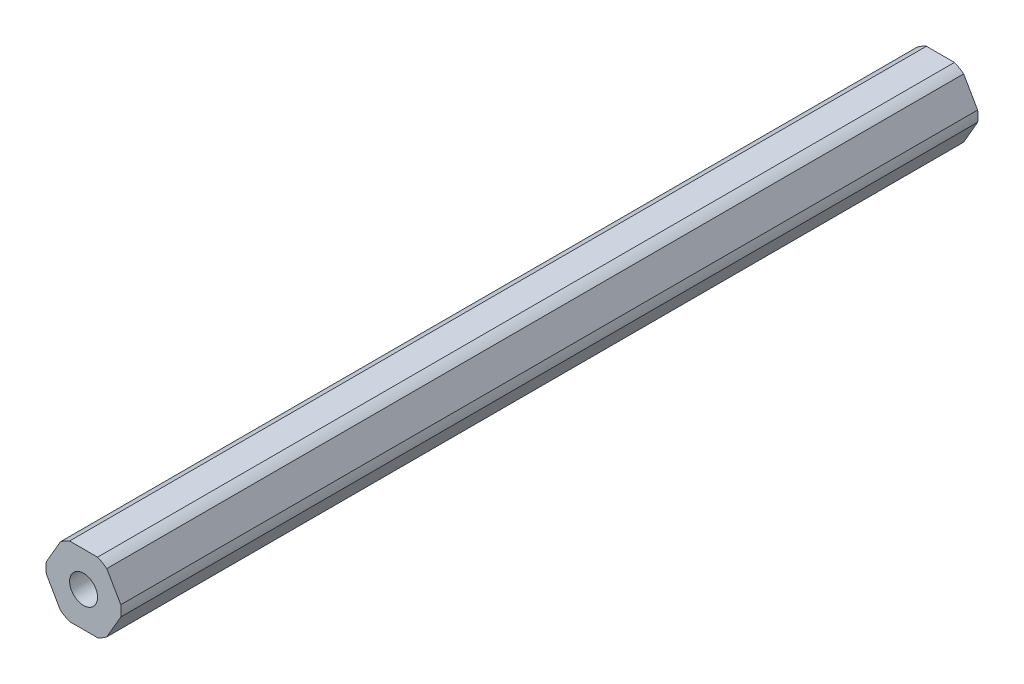
ISO-10303-21;
HEADER;
FILE_DESCRIPTION(('STEP AP214'),'2;1');
FILE_NAME('part.step','',(''),(''),'','','');
FILE_SCHEMA(('AUTOMOTIVE_DESIGN { 1 0 10303 214 1 1 1 1 }'));
ENDSEC;
DATA;
#1=APPLICATION_CONTEXT('core data for automotive mechanical design processes');
#2=APPLICATION_PROTOCOL_DEFINITION('international standard','automotive_design',2000,#1);
#3=PRODUCT_CONTEXT('',#1,'mechanical');
#4=PRODUCT('Part','Part','',(#3));
#5=PRODUCT_RELATED_PRODUCT_CATEGORY('part','',(#4));
#6=PRODUCT_DEFINITION_FORMATION('','',#4);
#7=PRODUCT_DEFINITION_CONTEXT('part definition',#1,'design');
#8=PRODUCT_DEFINITION('design','',#6,#7);
#9=PRODUCT_DEFINITION_SHAPE('','',#8);
#10=(LENGTH_UNIT() NAMED_UNIT(*) SI_UNIT(.MILLI.,.METRE.));
#11=(NAMED_UNIT(*) PLANE_ANGLE_UNIT() SI_UNIT($,.RADIAN.));
#12=(NAMED_UNIT(*) SI_UNIT($,.STERADIAN.) SOLID_ANGLE_UNIT());
#13=UNCERTAINTY_MEASURE_WITH_UNIT(LENGTH_MEASURE(1.E-05),#10,'distance_accuracy_value','');
#14=(GEOMETRIC_REPRESENTATION_CONTEXT(3) GLOBAL_UNCERTAINTY_ASSIGNED_CONTEXT((#13)) GLOBAL_UNIT_ASSIGNED_CONTEXT((#10,
#11,#12)) REPRESENTATION_CONTEXT('',''));
#15=CARTESIAN_POINT('',(0.,0.,0.));
#16=DIRECTION('',(0.,0.,1.));
#17=DIRECTION('',(1.,0.,0.));
#18=AXIS2_PLACEMENT_3D('',#15,#16,#17);
#19=CARTESIAN_POINT('',(0.,0.,-228.6));
#20=DIRECTION('',(0.,0.,1.));
#21=DIRECTION('',(1.,0.,0.));
#22=AXIS2_PLACEMENT_3D('',#19,#20,#21);
#23=CYLINDRICAL_SURFACE('',#22,6.87);
#24=CARTESIAN_POINT('',(0.,0.,78.2604999999997));
#25=DIRECTION('',(0.,0.,-1.));
#26=DIRECTION('',(-1.,0.,0.));
#27=AXIS2_PLACEMENT_3D('',#24,#25,#26);
#28=CIRCLE('',#27,6.87);
#29=CARTESIAN_POINT('',(6.80102150534208,-0.971085209378955,78.2604999999997));
#30=VERTEX_POINT('',#29);
#31=CARTESIAN_POINT('',(6.80102150534208,0.97108520937895,78.2604999999997));
#32=VERTEX_POINT('',#31);
#33=EDGE_CURVE('E141',#30,#32,#28,.F.);
#34=ORIENTED_EDGE('',*,*,#33,.F.);
#35=DIRECTION('',(0.,0.,1.));
#36=VECTOR('',#35,1.);
#37=CARTESIAN_POINT('',(6.80102150534208,-0.971085209378955,228.6));
#38=LINE('',#37,#36);
#39=CARTESIAN_POINT('',(6.80102150534208,-0.971085209378955,-78.2604999999993));
#40=VERTEX_POINT('',#39);
#41=EDGE_CURVE('E213',#30,#40,#38,.F.);
#42=ORIENTED_EDGE('',*,*,#41,.T.);
#43=CARTESIAN_POINT('',(0.,0.,-78.2604999999993));
#44=DIRECTION('',(0.,0.,1.));
#45=DIRECTION('',(1.,0.,0.));
#46=AXIS2_PLACEMENT_3D('',#43,#44,#45);
#47=CIRCLE('',#46,6.87);
#48=CARTESIAN_POINT('',(6.80102150534208,0.97108520937895,-78.2604999999993));
#49=VERTEX_POINT('',#48);
#50=EDGE_CURVE('E178',#49,#40,#47,.F.);
#51=ORIENTED_EDGE('',*,*,#50,.F.);
#52=DIRECTION('',(0.,0.,1.));
#53=VECTOR('',#52,1.);
#54=CARTESIAN_POINT('',(6.80102150534208,0.97108520937895,228.6));
#55=LINE('',#54,#53);
#56=EDGE_CURVE('E205',#49,#32,#55,.T.);
#57=ORIENTED_EDGE('',*,*,#56,.T.);
#58=EDGE_LOOP('',(#34,#42,#51,#57));
#59=FACE_BOUND('',#58,.T.);
#60=ADVANCED_FACE('F36',(#59),#23,.T.);
#61=CARTESIAN_POINT('',(3.68083890619154,6.3754,228.6));
#62=DIRECTION('',(0.,-1.,0.));
#63=DIRECTION('',(1.,0.,0.));
#64=AXIS2_PLACEMENT_3D('',#61,#62,#63);
#65=PLANE('',#64);
#66=DIRECTION('',(0.,0.,1.));
#67=VECTOR('',#66,1.);
#68=CARTESIAN_POINT('',(-2.55952629210953,6.37540000000001,-228.6));
#69=LINE('',#68,#67);
#70=CARTESIAN_POINT('',(-2.55952629210953,6.37540000000001,78.2604999999997));
#71=VERTEX_POINT('',#70);
#72=CARTESIAN_POINT('',(-2.55952629210953,6.37540000000001,-78.2604999999993));
#73=VERTEX_POINT('',#72);
#74=EDGE_CURVE('E139',#71,#73,#69,.F.);
#75=ORIENTED_EDGE('',*,*,#74,.F.);
#76=DIRECTION('',(1.,0.,0.));
#77=VECTOR('',#76,1.);
#78=CARTESIAN_POINT('',(3.68083890619154,6.3754,78.2604999999997));
#79=LINE('',#78,#77);
#80=CARTESIAN_POINT('',(2.55952629210953,6.37540000000001,78.2604999999997));
#81=VERTEX_POINT('',#80);
#82=EDGE_CURVE('E137',#71,#81,#79,.T.);
#83=ORIENTED_EDGE('',*,*,#82,.T.);
#84=DIRECTION('',(0.,0.,1.));
#85=VECTOR('',#84,1.);
#86=CARTESIAN_POINT('',(2.55952629210953,6.37540000000001,-228.6));
#87=LINE('',#86,#85);
#88=CARTESIAN_POINT('',(2.55952629210953,6.37540000000001,-78.2604999999993));
#89=VERTEX_POINT('',#88);
#90=EDGE_CURVE('E12',#89,#81,#87,.T.);
#91=ORIENTED_EDGE('',*,*,#90,.F.);
#92=DIRECTION('',(-1.,0.,0.));
#93=VECTOR('',#92,1.);
#94=CARTESIAN_POINT('',(3.68083890619154,6.3754,-78.2604999999993));
#95=LINE('',#94,#93);
#96=EDGE_CURVE('E176',#89,#73,#95,.T.);
#97=ORIENTED_EDGE('',*,*,#96,.T.);
#98=EDGE_LOOP('',(#75,#83,#91,#97));
#99=FACE_BOUND('',#98,.T.);
#100=ADVANCED_FACE('F138',(#99),#65,.F.);
#101=CARTESIAN_POINT('',(0.,0.,-228.6));
#102=DIRECTION('',(0.,0.,1.));
#103=DIRECTION('',(1.,0.,0.));
#104=AXIS2_PLACEMENT_3D('',#101,#102,#103);
#105=CYLINDRICAL_SURFACE('',#104,6.87);
#106=CARTESIAN_POINT('',(0.,0.,78.2604999999997));
#107=DIRECTION('',(0.,0.,-1.));
#108=DIRECTION('',(-1.,0.,0.));
#109=AXIS2_PLACEMENT_3D('',#106,#107,#108);
#110=CIRCLE('',#109,6.87);
#111=CARTESIAN_POINT('',(-4.24149521323255,5.40431479062104,78.2604999999997));
#112=VERTEX_POINT('',#111);
#113=EDGE_CURVE('E52',#71,#112,#110,.F.);
#114=ORIENTED_EDGE('',*,*,#113,.F.);
#115=ORIENTED_EDGE('',*,*,#74,.T.);
#116=CARTESIAN_POINT('',(0.,0.,-78.2604999999993));
#117=DIRECTION('',(0.,0.,1.));
#118=DIRECTION('',(1.,0.,0.));
#119=AXIS2_PLACEMENT_3D('',#116,#117,#118);
#120=CIRCLE('',#119,6.87);
#121=CARTESIAN_POINT('',(-4.24149521323255,5.40431479062104,-78.2604999999993));
#122=VERTEX_POINT('',#121);
#123=EDGE_CURVE('E202',#122,#73,#120,.F.);
#124=ORIENTED_EDGE('',*,*,#123,.F.);
#125=DIRECTION('',(0.,0.,1.));
#126=VECTOR('',#125,1.);
#127=CARTESIAN_POINT('',(-4.24149521323255,5.40431479062104,228.6));
#128=LINE('',#127,#126);
#129=EDGE_CURVE('E227',#122,#112,#128,.T.);
#130=ORIENTED_EDGE('',*,*,#129,.T.);
#131=EDGE_LOOP('',(#114,#115,#124,#130));
#132=FACE_BOUND('',#131,.T.);
#133=ADVANCED_FACE('F251',(#132),#105,.T.);
#134=CARTESIAN_POINT('',(-3.68083890619154,6.3754,228.6));
#135=DIRECTION('',(0.866025403784439,-0.5,0.));
#136=DIRECTION('',(0.5,0.866025403784439,0.));
#137=AXIS2_PLACEMENT_3D('',#134,#135,#136);
#138=PLANE('',#137);
#139=DIRECTION('',(0.,0.,1.));
#140=VECTOR('',#139,1.);
#141=CARTESIAN_POINT('',(-6.80102150534208,0.971085209378959,-228.6));
#142=LINE('',#141,#140);
#143=CARTESIAN_POINT('',(-6.80102150534208,0.971085209378959,78.2604999999997));
#144=VERTEX_POINT('',#143);
#145=CARTESIAN_POINT('',(-6.80102150534208,0.971085209378959,-78.2604999999993));
#146=VERTEX_POINT('',#145);
#147=EDGE_CURVE('E225',#144,#146,#142,.F.);
#148=ORIENTED_EDGE('',*,*,#147,.F.);
#149=DIRECTION('',(0.5,0.866025403784439,0.));
#150=VECTOR('',#149,1.);
#151=CARTESIAN_POINT('',(-3.68083890619154,6.3754,78.2604999999997));
#152=LINE('',#151,#150);
#153=EDGE_CURVE('E60',#144,#112,#152,.T.);
#154=ORIENTED_EDGE('',*,*,#153,.T.);
#155=ORIENTED_EDGE('',*,*,#129,.F.);
#156=DIRECTION('',(-0.5,-0.866025403784439,0.));
#157=VECTOR('',#156,1.);
#158=CARTESIAN_POINT('',(-3.68083890619154,6.3754,-78.2604999999993));
#159=LINE('',#158,#157);
#160=EDGE_CURVE('E199',#122,#146,#159,.T.);
#161=ORIENTED_EDGE('',*,*,#160,.T.);
#162=EDGE_LOOP('',(#148,#154,#155,#161));
#163=FACE_BOUND('',#162,.T.);
#164=ADVANCED_FACE('F270',(#163),#138,.F.);
#165=CARTESIAN_POINT('',(0.,0.,-228.6));
#166=DIRECTION('',(0.,0.,1.));
#167=DIRECTION('',(1.,0.,0.));
#168=AXIS2_PLACEMENT_3D('',#165,#166,#167);
#169=CYLINDRICAL_SURFACE('',#168,6.87);
#170=CARTESIAN_POINT('',(0.,0.,78.2604999999997));
#171=DIRECTION('',(0.,0.,-1.));
#172=DIRECTION('',(-1.,0.,0.));
#173=AXIS2_PLACEMENT_3D('',#170,#171,#172);
#174=CIRCLE('',#173,6.87);
#175=CARTESIAN_POINT('',(-6.80102150534208,-0.971085209378956,78.2604999999997));
#176=VERTEX_POINT('',#175);
#177=EDGE_CURVE('E166',#144,#176,#174,.F.);
#178=ORIENTED_EDGE('',*,*,#177,.F.);
#179=ORIENTED_EDGE('',*,*,#147,.T.);
#180=CARTESIAN_POINT('',(0.,0.,-78.2604999999993));
#181=DIRECTION('',(0.,0.,1.));
#182=DIRECTION('',(1.,0.,0.));
#183=AXIS2_PLACEMENT_3D('',#180,#181,#182);
#184=CIRCLE('',#183,6.87);
#185=CARTESIAN_POINT('',(-6.80102150534208,-0.971085209378956,-78.2604999999993));
#186=VERTEX_POINT('',#185);
#187=EDGE_CURVE('E196',#186,#146,#184,.F.);
#188=ORIENTED_EDGE('',*,*,#187,.F.);
#189=DIRECTION('',(0.,0.,1.));
#190=VECTOR('',#189,1.);
#191=CARTESIAN_POINT('',(-6.80102150534208,-0.971085209378956,228.6));
#192=LINE('',#191,#190);
#193=EDGE_CURVE('E222',#186,#176,#192,.T.);
#194=ORIENTED_EDGE('',*,*,#193,.T.);
#195=EDGE_LOOP('',(#178,#179,#188,#194));
#196=FACE_BOUND('',#195,.T.);
#197=ADVANCED_FACE('F274',(#196),#169,.T.);
#198=CARTESIAN_POINT('',(-7.36167781238308,0.,228.6));
#199=DIRECTION('',(0.866025403784439,0.5,0.));
#200=DIRECTION('',(-0.5,0.866025403784439,0.));
#201=AXIS2_PLACEMENT_3D('',#198,#199,#200);
#202=PLANE('',#201);
#203=DIRECTION('',(0.,0.,1.));
#204=VECTOR('',#203,1.);
#205=CARTESIAN_POINT('',(-4.24149521323255,-5.40431479062105,-228.6));
#206=LINE('',#205,#204);
#207=CARTESIAN_POINT('',(-4.24149521323255,-5.40431479062105,78.2604999999997));
#208=VERTEX_POINT('',#207);
#209=CARTESIAN_POINT('',(-4.24149521323255,-5.40431479062105,-78.2604999999993));
#210=VERTEX_POINT('',#209);
#211=EDGE_CURVE('E220',#208,#210,#206,.F.);
#212=ORIENTED_EDGE('',*,*,#211,.F.);
#213=DIRECTION('',(-0.5,0.866025403784439,0.));
#214=VECTOR('',#213,1.);
#215=CARTESIAN_POINT('',(-7.36167781238308,0.,78.2604999999997));
#216=LINE('',#215,#214);
#217=EDGE_CURVE('E164',#208,#176,#216,.T.);
#218=ORIENTED_EDGE('',*,*,#217,.T.);
#219=ORIENTED_EDGE('',*,*,#193,.F.);
#220=DIRECTION('',(0.5,-0.866025403784439,0.));
#221=VECTOR('',#220,1.);
#222=CARTESIAN_POINT('',(-7.36167781238308,0.,-78.2604999999993));
#223=LINE('',#222,#221);
#224=EDGE_CURVE('E193',#186,#210,#223,.T.);
#225=ORIENTED_EDGE('',*,*,#224,.T.);
#226=EDGE_LOOP('',(#212,#218,#219,#225));
#227=FACE_BOUND('',#226,.T.);
#228=ADVANCED_FACE('F277',(#227),#202,.F.);
#229=CARTESIAN_POINT('',(0.,0.,-228.6));
#230=DIRECTION('',(0.,0.,1.));
#231=DIRECTION('',(1.,0.,0.));
#232=AXIS2_PLACEMENT_3D('',#229,#230,#231);
#233=CYLINDRICAL_SURFACE('',#232,6.87);
#234=CARTESIAN_POINT('',(0.,0.,78.2604999999997));
#235=DIRECTION('',(0.,0.,-1.));
#236=DIRECTION('',(-1.,0.,0.));
#237=AXIS2_PLACEMENT_3D('',#234,#235,#236);
#238=CIRCLE('',#237,6.87);
#239=CARTESIAN_POINT('',(-2.55952629210953,-6.3754,78.2604999999997));
#240=VERTEX_POINT('',#239);
#241=EDGE_CURVE('E161',#208,#240,#238,.F.);
#242=ORIENTED_EDGE('',*,*,#241,.F.);
#243=ORIENTED_EDGE('',*,*,#211,.T.);
#244=CARTESIAN_POINT('',(0.,0.,-78.2604999999993));
#245=DIRECTION('',(0.,0.,1.));
#246=DIRECTION('',(1.,0.,0.));
#247=AXIS2_PLACEMENT_3D('',#244,#245,#246);
#248=CIRCLE('',#247,6.87);
#249=CARTESIAN_POINT('',(-2.55952629210953,-6.3754,-78.2604999999993));
#250=VERTEX_POINT('',#249);
#251=EDGE_CURVE('E190',#250,#210,#248,.F.);
#252=ORIENTED_EDGE('',*,*,#251,.F.);
#253=DIRECTION('',(0.,0.,1.));
#254=VECTOR('',#253,1.);
#255=CARTESIAN_POINT('',(-2.55952629210953,-6.3754,228.6));
#256=LINE('',#255,#254);
#257=EDGE_CURVE('E217',#250,#240,#256,.T.);
#258=ORIENTED_EDGE('',*,*,#257,.T.);
#259=EDGE_LOOP('',(#242,#243,#252,#258));
#260=FACE_BOUND('',#259,.T.);
#261=ADVANCED_FACE('F280',(#260),#233,.T.);
#262=CARTESIAN_POINT('',(-3.68083890619154,-6.3754,228.6));
#263=DIRECTION('',(0.,1.,0.));
#264=DIRECTION('',(0.,0.,1.));
#265=AXIS2_PLACEMENT_3D('',#262,#263,#264);
#266=PLANE('',#265);
#267=DIRECTION('',(0.,0.,1.));
#268=VECTOR('',#267,1.);
#269=CARTESIAN_POINT('',(2.55952629210953,-6.3754,-228.6));
#270=LINE('',#269,#268);
#271=CARTESIAN_POINT('',(2.55952629210953,-6.3754,78.2604999999997));
#272=VERTEX_POINT('',#271);
#273=CARTESIAN_POINT('',(2.55952629210953,-6.3754,-78.2604999999993));
#274=VERTEX_POINT('',#273);
#275=EDGE_CURVE('E215',#272,#274,#270,.F.);
#276=ORIENTED_EDGE('',*,*,#275,.F.);
#277=DIRECTION('',(-1.,0.,0.));
#278=VECTOR('',#277,1.);
#279=CARTESIAN_POINT('',(-3.68083890619154,-6.3754,78.2604999999997));
#280=LINE('',#279,#278);
#281=EDGE_CURVE('E159',#272,#240,#280,.T.);
#282=ORIENTED_EDGE('',*,*,#281,.T.);
#283=ORIENTED_EDGE('',*,*,#257,.F.);
#284=DIRECTION('',(1.,0.,0.));
#285=VECTOR('',#284,1.);
#286=CARTESIAN_POINT('',(-3.68083890619154,-6.3754,-78.2604999999993));
#287=LINE('',#286,#285);
#288=EDGE_CURVE('E187',#250,#274,#287,.T.);
#289=ORIENTED_EDGE('',*,*,#288,.T.);
#290=EDGE_LOOP('',(#276,#282,#283,#289));
#291=FACE_BOUND('',#290,.T.);
#292=ADVANCED_FACE('F264',(#291),#266,.F.);
#293=CARTESIAN_POINT('',(0.,0.,-228.6));
#294=DIRECTION('',(0.,0.,1.));
#295=DIRECTION('',(1.,0.,0.));
#296=AXIS2_PLACEMENT_3D('',#293,#294,#295);
#297=CYLINDRICAL_SURFACE('',#296,6.87);
#298=CARTESIAN_POINT('',(0.,0.,78.2604999999997));
#299=DIRECTION('',(0.,0.,-1.));
#300=DIRECTION('',(-1.,0.,0.));
#301=AXIS2_PLACEMENT_3D('',#298,#299,#300);
#302=CIRCLE('',#301,6.87);
#303=CARTESIAN_POINT('',(4.24149521323254,-5.40431479062105,78.2604999999997));
#304=VERTEX_POINT('',#303);
#305=EDGE_CURVE('E156',#272,#304,#302,.F.);
#306=ORIENTED_EDGE('',*,*,#305,.F.);
#307=ORIENTED_EDGE('',*,*,#275,.T.);
#308=CARTESIAN_POINT('',(0.,0.,-78.2604999999993));
#309=DIRECTION('',(0.,0.,1.));
#310=DIRECTION('',(1.,0.,0.));
#311=AXIS2_PLACEMENT_3D('',#308,#309,#310);
#312=CIRCLE('',#311,6.87);
#313=CARTESIAN_POINT('',(4.24149521323254,-5.40431479062105,-78.2604999999993));
#314=VERTEX_POINT('',#313);
#315=EDGE_CURVE('E184',#314,#274,#312,.F.);
#316=ORIENTED_EDGE('',*,*,#315,.F.);
#317=DIRECTION('',(0.,0.,1.));
#318=VECTOR('',#317,1.);
#319=CARTESIAN_POINT('',(4.24149521323254,-5.40431479062105,228.6));
#320=LINE('',#319,#318);
#321=EDGE_CURVE('E210',#314,#304,#320,.T.);
#322=ORIENTED_EDGE('',*,*,#321,.T.);
#323=EDGE_LOOP('',(#306,#307,#316,#322));
#324=FACE_BOUND('',#323,.T.);
#325=ADVANCED_FACE('F262',(#324),#297,.T.);
#326=CARTESIAN_POINT('',(3.68083890619154,-6.3754,228.6));
#327=DIRECTION('',(-0.866025403784439,0.5,0.));
#328=DIRECTION('',(-0.5,-0.866025403784439,0.));
#329=AXIS2_PLACEMENT_3D('',#326,#327,#328);
#330=PLANE('',#329);
#331=ORIENTED_EDGE('',*,*,#41,.F.);
#332=DIRECTION('',(-0.5,-0.866025403784439,0.));
#333=VECTOR('',#332,1.);
#334=CARTESIAN_POINT('',(3.68083890619154,-6.3754,78.2604999999997));
#335=LINE('',#334,#333);
#336=EDGE_CURVE('E154',#30,#304,#335,.T.);
#337=ORIENTED_EDGE('',*,*,#336,.T.);
#338=ORIENTED_EDGE('',*,*,#321,.F.);
#339=DIRECTION('',(0.5,0.866025403784439,0.));
#340=VECTOR('',#339,1.);
#341=CARTESIAN_POINT('',(3.68083890619154,-6.3754,-78.2604999999993));
#342=LINE('',#341,#340);
#343=EDGE_CURVE('E181',#314,#40,#342,.T.);
#344=ORIENTED_EDGE('',*,*,#343,.T.);
#345=EDGE_LOOP('',(#331,#337,#338,#344));
#346=FACE_BOUND('',#345,.T.);
#347=ADVANCED_FACE('F256',(#346),#330,.F.);
#348=CARTESIAN_POINT('',(7.36167781238308,0.,228.6));
#349=DIRECTION('',(-0.866025403784439,-0.5,0.));
#350=DIRECTION('',(0.5,-0.866025403784439,0.));
#351=AXIS2_PLACEMENT_3D('',#348,#349,#350);
#352=PLANE('',#351);
#353=DIRECTION('',(0.,0.,1.));
#354=VECTOR('',#353,1.);
#355=CARTESIAN_POINT('',(4.24149521323254,5.40431479062105,-228.6));
#356=LINE('',#355,#354);
#357=CARTESIAN_POINT('',(4.24149521323254,5.40431479062105,78.2604999999997));
#358=VERTEX_POINT('',#357);
#359=CARTESIAN_POINT('',(4.24149521323254,5.40431479062105,-78.2604999999993));
#360=VERTEX_POINT('',#359);
#361=EDGE_CURVE('E44',#358,#360,#356,.F.);
#362=ORIENTED_EDGE('',*,*,#361,.F.);
#363=DIRECTION('',(0.5,-0.866025403784439,0.));
#364=VECTOR('',#363,1.);
#365=CARTESIAN_POINT('',(7.36167781238308,0.,78.2604999999997));
#366=LINE('',#365,#364);
#367=EDGE_CURVE('E142',#358,#32,#366,.T.);
#368=ORIENTED_EDGE('',*,*,#367,.T.);
#369=ORIENTED_EDGE('',*,*,#56,.F.);
#370=DIRECTION('',(-0.5,0.866025403784439,0.));
#371=VECTOR('',#370,1.);
#372=CARTESIAN_POINT('',(7.36167781238308,0.,-78.2604999999993));
#373=LINE('',#372,#371);
#374=EDGE_CURVE('E173',#49,#360,#373,.T.);
#375=ORIENTED_EDGE('',*,*,#374,.T.);
#376=EDGE_LOOP('',(#362,#368,#369,#375));
#377=FACE_BOUND('',#376,.T.);
#378=ADVANCED_FACE('F269',(#377),#352,.F.);
#379=CARTESIAN_POINT('',(0.,0.,-228.6));
#380=DIRECTION('',(0.,0.,1.));
#381=DIRECTION('',(1.,0.,0.));
#382=AXIS2_PLACEMENT_3D('',#379,#380,#381);
#383=CYLINDRICAL_SURFACE('',#382,6.87);
#384=CARTESIAN_POINT('',(0.,0.,78.2604999999997));
#385=DIRECTION('',(0.,0.,-1.));
#386=DIRECTION('',(-1.,0.,0.));
#387=AXIS2_PLACEMENT_3D('',#384,#385,#386);
#388=CIRCLE('',#387,6.87);
#389=EDGE_CURVE('E129',#358,#81,#388,.F.);
#390=ORIENTED_EDGE('',*,*,#389,.F.);
#391=ORIENTED_EDGE('',*,*,#361,.T.);
#392=CARTESIAN_POINT('',(0.,0.,-78.2604999999993));
#393=DIRECTION('',(0.,0.,1.));
#394=DIRECTION('',(1.,0.,0.));
#395=AXIS2_PLACEMENT_3D('',#392,#393,#394);
#396=CIRCLE('',#395,6.87);
#397=EDGE_CURVE('E132',#89,#360,#396,.F.);
#398=ORIENTED_EDGE('',*,*,#397,.F.);
#399=ORIENTED_EDGE('',*,*,#90,.T.);
#400=EDGE_LOOP('',(#390,#391,#398,#399));
#401=FACE_BOUND('',#400,.T.);
#402=ADVANCED_FACE('F127',(#401),#383,.T.);
#403=CARTESIAN_POINT('',(0.,0.,-228.6));
#404=DIRECTION('',(0.,0.,1.));
#405=DIRECTION('',(1.,0.,0.));
#406=AXIS2_PLACEMENT_3D('',#403,#404,#405);
#407=CYLINDRICAL_SURFACE('',#406,2.55);
#408=CARTESIAN_POINT('',(0.,0.,78.2604999999997));
#409=DIRECTION('',(0.,0.,-1.));
#410=DIRECTION('',(-1.,0.,0.));
#411=AXIS2_PLACEMENT_3D('',#408,#409,#410);
#412=CIRCLE('',#411,2.55);
#413=CARTESIAN_POINT('',(-2.55,0.,78.2604999999997));
#414=VERTEX_POINT('',#413);
#415=EDGE_CURVE('E39',#414,#414,#412,.F.);
#416=ORIENTED_EDGE('',*,*,#415,.T.);
#417=EDGE_LOOP('',(#416));
#418=FACE_BOUND('',#417,.T.);
#419=CARTESIAN_POINT('',(0.,0.,-78.2604999999993));
#420=DIRECTION('',(0.,0.,1.));
#421=DIRECTION('',(1.,0.,0.));
#422=AXIS2_PLACEMENT_3D('',#419,#420,#421);
#423=CIRCLE('',#422,2.55);
#424=CARTESIAN_POINT('',(2.55,0.,-78.2604999999993));
#425=VERTEX_POINT('',#424);
#426=EDGE_CURVE('E171',#425,#425,#423,.F.);
#427=ORIENTED_EDGE('',*,*,#426,.T.);
#428=EDGE_LOOP('',(#427));
#429=FACE_BOUND('',#428,.T.);
#430=ADVANCED_FACE('F232',(#418,#429),#407,.F.);
#431=CARTESIAN_POINT('',(0.,0.,-78.2604999999993));
#432=DIRECTION('',(0.,0.,1.));
#433=DIRECTION('',(1.,0.,0.));
#434=AXIS2_PLACEMENT_3D('',#431,#432,#433);
#435=PLANE('',#434);
#436=ORIENTED_EDGE('',*,*,#160,.F.);
#437=ORIENTED_EDGE('',*,*,#123,.T.);
#438=ORIENTED_EDGE('',*,*,#96,.F.);
#439=ORIENTED_EDGE('',*,*,#397,.T.);
#440=ORIENTED_EDGE('',*,*,#374,.F.);
#441=ORIENTED_EDGE('',*,*,#50,.T.);
#442=ORIENTED_EDGE('',*,*,#343,.F.);
#443=ORIENTED_EDGE('',*,*,#315,.T.);
#444=ORIENTED_EDGE('',*,*,#288,.F.);
#445=ORIENTED_EDGE('',*,*,#251,.T.);
#446=ORIENTED_EDGE('',*,*,#224,.F.);
#447=ORIENTED_EDGE('',*,*,#187,.T.);
#448=EDGE_LOOP('',(#436,#437,#438,#439,#440,#441,#442,#443,#444,#445,#446,#447));
#449=FACE_BOUND('',#448,.T.);
#450=ORIENTED_EDGE('',*,*,#426,.F.);
#451=EDGE_LOOP('',(#450));
#452=FACE_BOUND('',#451,.T.);
#453=ADVANCED_FACE('F234',(#449,#452),#435,.F.);
#454=CARTESIAN_POINT('',(0.,0.,78.2604999999997));
#455=DIRECTION('',(0.,0.,-1.));
#456=DIRECTION('',(-1.,0.,0.));
#457=AXIS2_PLACEMENT_3D('',#454,#455,#456);
#458=PLANE('',#457);
#459=ORIENTED_EDGE('',*,*,#82,.F.);
#460=ORIENTED_EDGE('',*,*,#113,.T.);
#461=ORIENTED_EDGE('',*,*,#153,.F.);
#462=ORIENTED_EDGE('',*,*,#177,.T.);
#463=ORIENTED_EDGE('',*,*,#217,.F.);
#464=ORIENTED_EDGE('',*,*,#241,.T.);
#465=ORIENTED_EDGE('',*,*,#281,.F.);
#466=ORIENTED_EDGE('',*,*,#305,.T.);
#467=ORIENTED_EDGE('',*,*,#336,.F.);
#468=ORIENTED_EDGE('',*,*,#33,.T.);
#469=ORIENTED_EDGE('',*,*,#367,.F.);
#470=ORIENTED_EDGE('',*,*,#389,.T.);
#471=EDGE_LOOP('',(#459,#460,#461,#462,#463,#464,#465,#466,#467,#468,#469,#470));
#472=FACE_BOUND('',#471,.T.);
#473=ORIENTED_EDGE('',*,*,#415,.F.);
#474=EDGE_LOOP('',(#473));
#475=FACE_BOUND('',#474,.T.);
#476=ADVANCED_FACE('F145',(#472,#475),#458,.F.);
#477=CLOSED_SHELL('',(#60,#100,#133,#164,#197,#228,#261,#292,#325,#347,#378,#402,#430,#453,#476));
#478=MANIFOLD_SOLID_BREP('B2',#477);
#479=ADVANCED_BREP_SHAPE_REPRESENTATION('',(#18,#478),#14);
#480=SHAPE_DEFINITION_REPRESENTATION(#9,#479);
ENDSEC;
END-ISO-10303-21;
